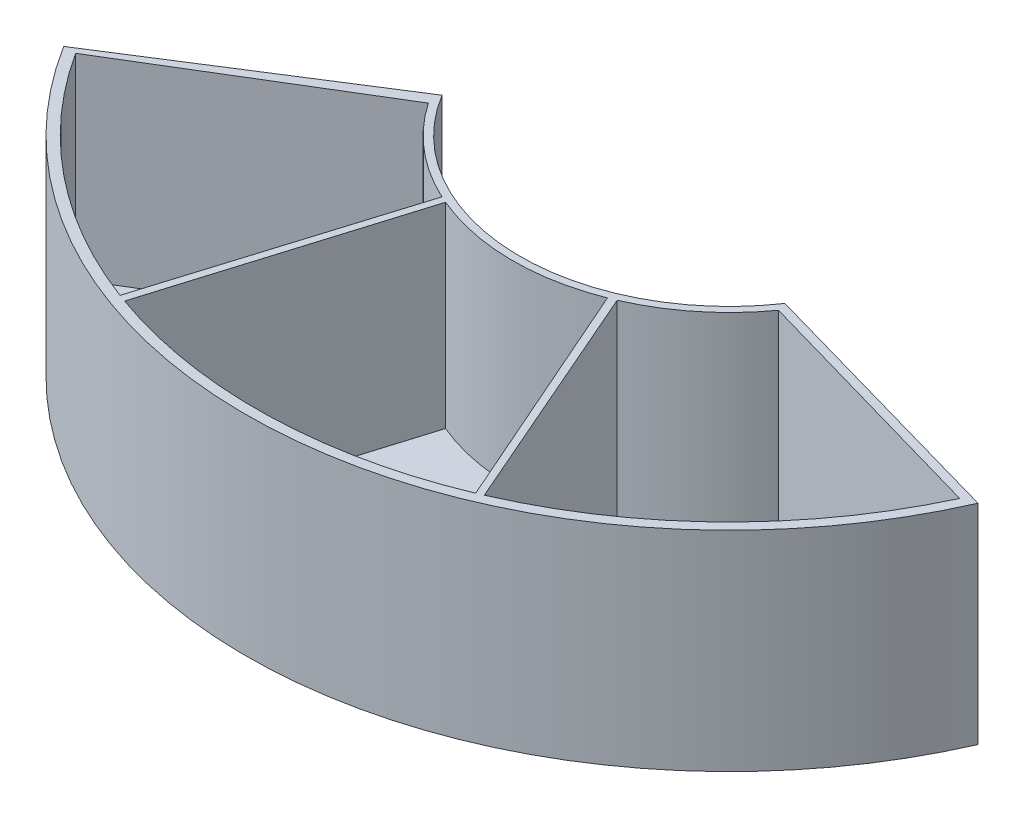
ISO-10303-21;
HEADER;
FILE_DESCRIPTION(('STEP AP214'),'2;1');
FILE_NAME('part.step','',(''),(''),'','','');
FILE_SCHEMA(('AUTOMOTIVE_DESIGN { 1 0 10303 214 1 1 1 1 }'));
ENDSEC;
DATA;
#1=APPLICATION_CONTEXT('core data for automotive mechanical design processes');
#2=APPLICATION_PROTOCOL_DEFINITION('international standard','automotive_design',2000,#1);
#3=PRODUCT_CONTEXT('',#1,'mechanical');
#4=PRODUCT('Part','Part','',(#3));
#5=PRODUCT_RELATED_PRODUCT_CATEGORY('part','',(#4));
#6=PRODUCT_DEFINITION_FORMATION('','',#4);
#7=PRODUCT_DEFINITION_CONTEXT('part definition',#1,'design');
#8=PRODUCT_DEFINITION('design','',#6,#7);
#9=PRODUCT_DEFINITION_SHAPE('','',#8);
#10=(LENGTH_UNIT() NAMED_UNIT(*) SI_UNIT(.MILLI.,.METRE.));
#11=(NAMED_UNIT(*) PLANE_ANGLE_UNIT() SI_UNIT($,.RADIAN.));
#12=(NAMED_UNIT(*) SI_UNIT($,.STERADIAN.) SOLID_ANGLE_UNIT());
#13=UNCERTAINTY_MEASURE_WITH_UNIT(LENGTH_MEASURE(1.E-05),#10,'distance_accuracy_value','');
#14=(GEOMETRIC_REPRESENTATION_CONTEXT(3) GLOBAL_UNCERTAINTY_ASSIGNED_CONTEXT((#13)) GLOBAL_UNIT_ASSIGNED_CONTEXT((#10,
#11,#12)) REPRESENTATION_CONTEXT('',''));
#15=CARTESIAN_POINT('',(0.,0.,0.));
#16=DIRECTION('',(0.,0.,1.));
#17=DIRECTION('',(1.,0.,0.));
#18=AXIS2_PLACEMENT_3D('',#15,#16,#17);
#19=CARTESIAN_POINT('',(0.,80.,0.));
#20=DIRECTION('',(0.,1.,0.));
#21=DIRECTION('',(0.,0.,1.));
#22=AXIS2_PLACEMENT_3D('',#19,#20,#21);
#23=PLANE('',#22);
#24=CARTESIAN_POINT('',(0.,80.,0.));
#25=DIRECTION('',(0.,-1.,0.));
#26=DIRECTION('',(0.,0.,1.));
#27=AXIS2_PLACEMENT_3D('',#24,#25,#26);
#28=CIRCLE('',#27,80.0217204236368);
#29=CARTESIAN_POINT('',(66.2129913480088,80.,44.9367946821667));
#30=VERTEX_POINT('',#29);
#31=CARTESIAN_POINT('',(-68.4050298517927,80.,41.5238200378295));
#32=VERTEX_POINT('',#31);
#33=EDGE_CURVE('E251',#30,#32,#28,.T.);
#34=ORIENTED_EDGE('',*,*,#33,.T.);
#35=DIRECTION('',(-0.844227086214368,0.,0.53598565923166));
#36=VECTOR('',#35,1.);
#37=CARTESIAN_POINT('',(-68.4050298517927,80.,41.5238200378295));
#38=LINE('',#37,#36);
#39=CARTESIAN_POINT('',(-156.962867051797,80.,97.7477099447707));
#40=VERTEX_POINT('',#39);
#41=EDGE_CURVE('E258',#32,#40,#38,.T.);
#42=ORIENTED_EDGE('',*,*,#41,.T.);
#43=CARTESIAN_POINT('',(0.,80.,0.));
#44=DIRECTION('',(0.,1.,0.));
#45=DIRECTION('',(0.,0.,1.));
#46=AXIS2_PLACEMENT_3D('',#43,#44,#45);
#47=CIRCLE('',#46,184.910671494555);
#48=CARTESIAN_POINT('',(169.373640637876,80.,74.1924948336331));
#49=VERTEX_POINT('',#48);
#50=EDGE_CURVE('E260',#40,#49,#47,.T.);
#51=ORIENTED_EDGE('',*,*,#50,.T.);
#52=DIRECTION('',(-0.962061025328391,0.,-0.272834351840243));
#53=VECTOR('',#52,1.);
#54=CARTESIAN_POINT('',(66.2129913480088,80.,44.9367946821667));
#55=LINE('',#54,#53);
#56=EDGE_CURVE('E263',#49,#30,#55,.T.);
#57=ORIENTED_EDGE('',*,*,#56,.T.);
#58=EDGE_LOOP('',(#34,#42,#51,#57));
#59=FACE_BOUND('',#58,.T.);
#60=DIRECTION('',(-0.291273412955168,0.,0.956639848064802));
#61=VECTOR('',#60,1.);
#62=CARTESIAN_POINT('',(-32.2612286960459,80.,76.3245873766926));
#63=LINE('',#62,#61);
#64=CARTESIAN_POINT('',(-32.2612286960459,80.,76.3245873766926));
#65=VERTEX_POINT('',#64);
#66=CARTESIAN_POINT('',(-60.9332233634748,80.,170.493060716158));
#67=VERTEX_POINT('',#66);
#68=EDGE_CURVE('E240',#65,#67,#63,.T.);
#69=ORIENTED_EDGE('',*,*,#68,.F.);
#70=CARTESIAN_POINT('',(0.,80.,0.));
#71=DIRECTION('',(0.,-1.,0.));
#72=DIRECTION('',(0.,0.,1.));
#73=AXIS2_PLACEMENT_3D('',#70,#71,#72);
#74=CIRCLE('',#73,82.8627148674297);
#75=CARTESIAN_POINT('',(30.4436458265412,80.,77.0675933449922));
#76=VERTEX_POINT('',#75);
#77=EDGE_CURVE('E234',#76,#65,#74,.T.);
#78=ORIENTED_EDGE('',*,*,#77,.F.);
#79=DIRECTION('',(-0.40217295362082,0.,-0.915563714536517));
#80=VECTOR('',#79,1.);
#81=CARTESIAN_POINT('',(30.4436458265412,80.,77.0675933449922));
#82=LINE('',#81,#80);
#83=CARTESIAN_POINT('',(69.9465672048778,80.,166.997662253339));
#84=VERTEX_POINT('',#83);
#85=EDGE_CURVE('E245',#84,#76,#82,.T.);
#86=ORIENTED_EDGE('',*,*,#85,.F.);
#87=CARTESIAN_POINT('',(0.,80.,0.));
#88=DIRECTION('',(0.,1.,0.));
#89=DIRECTION('',(0.,0.,1.));
#90=AXIS2_PLACEMENT_3D('',#87,#88,#89);
#91=CIRCLE('',#90,181.054526211931);
#92=EDGE_CURVE('E236',#67,#84,#91,.T.);
#93=ORIENTED_EDGE('',*,*,#92,.F.);
#94=EDGE_LOOP('',(#69,#78,#86,#93));
#95=FACE_BOUND('',#94,.T.);
#96=DIRECTION('',(-0.854855860349568,0.,0.518865549083768));
#97=VECTOR('',#96,1.);
#98=CARTESIAN_POINT('',(-152.401202955816,80.,97.7477099447707));
#99=LINE('',#98,#97);
#100=CARTESIAN_POINT('',(-68.4050298517927,80.,46.7651730048795));
#101=VERTEX_POINT('',#100);
#102=CARTESIAN_POINT('',(-152.401202955816,80.,97.7477099447706));
#103=VERTEX_POINT('',#102);
#104=EDGE_CURVE('E220',#101,#103,#99,.T.);
#105=ORIENTED_EDGE('',*,*,#104,.F.);
#106=CARTESIAN_POINT('',(0.,80.,0.));
#107=DIRECTION('',(0.,-1.,0.));
#108=DIRECTION('',(0.,0.,1.));
#109=AXIS2_PLACEMENT_3D('',#106,#107,#108);
#110=CIRCLE('',#109,82.8627148674298);
#111=CARTESIAN_POINT('',(-34.7254713536812,80.,75.2354381556034));
#112=VERTEX_POINT('',#111);
#113=EDGE_CURVE('E214',#112,#101,#110,.T.);
#114=ORIENTED_EDGE('',*,*,#113,.F.);
#115=DIRECTION('',(0.293742661285679,0.,-0.955884537452514));
#116=VECTOR('',#115,1.);
#117=CARTESIAN_POINT('',(-34.7254713536812,80.,75.2354381556034));
#118=LINE('',#117,#116);
#119=CARTESIAN_POINT('',(-63.6877906538465,80.,169.483352526018));
#120=VERTEX_POINT('',#119);
#121=EDGE_CURVE('E225',#120,#112,#118,.T.);
#122=ORIENTED_EDGE('',*,*,#121,.F.);
#123=CARTESIAN_POINT('',(0.,80.,0.));
#124=DIRECTION('',(0.,1.,0.));
#125=DIRECTION('',(0.,0.,1.));
#126=AXIS2_PLACEMENT_3D('',#123,#124,#125);
#127=CIRCLE('',#126,181.054526211931);
#128=EDGE_CURVE('E219',#103,#120,#127,.T.);
#129=ORIENTED_EDGE('',*,*,#128,.F.);
#130=EDGE_LOOP('',(#105,#114,#122,#129));
#131=FACE_BOUND('',#130,.T.);
#132=DIRECTION('',(-0.961583026948567,0.,-0.274514266085446));
#133=VECTOR('',#132,1.);
#134=CARTESIAN_POINT('',(67.2480144372819,80.,48.4141928513126));
#135=LINE('',#134,#133);
#136=CARTESIAN_POINT('',(164.278182262394,80.,76.1145209167776));
#137=VERTEX_POINT('',#136);
#138=CARTESIAN_POINT('',(67.2480144372819,80.,48.4141928513126));
#139=VERTEX_POINT('',#138);
#140=EDGE_CURVE('E203',#137,#139,#135,.T.);
#141=ORIENTED_EDGE('',*,*,#140,.F.);
#142=CARTESIAN_POINT('',(0.,80.,0.));
#143=DIRECTION('',(0.,1.,0.));
#144=DIRECTION('',(0.,0.,1.));
#145=AXIS2_PLACEMENT_3D('',#142,#143,#144);
#146=CIRCLE('',#145,181.054526211931);
#147=CARTESIAN_POINT('',(72.2517662339433,80.,166.01332397703));
#148=VERTEX_POINT('',#147);
#149=EDGE_CURVE('E201',#148,#137,#146,.T.);
#150=ORIENTED_EDGE('',*,*,#149,.F.);
#151=DIRECTION('',(0.399060811931153,0.,0.916924461654748));
#152=VECTOR('',#151,1.);
#153=CARTESIAN_POINT('',(33.0672622738161,80.,75.9788502210689));
#154=LINE('',#153,#152);
#155=CARTESIAN_POINT('',(33.0672622738161,80.,75.9788502210689));
#156=VERTEX_POINT('',#155);
#157=EDGE_CURVE('E159',#156,#148,#154,.T.);
#158=ORIENTED_EDGE('',*,*,#157,.F.);
#159=CARTESIAN_POINT('',(0.,80.,0.));
#160=DIRECTION('',(0.,-1.,0.));
#161=DIRECTION('',(0.,0.,1.));
#162=AXIS2_PLACEMENT_3D('',#159,#160,#161);
#163=CIRCLE('',#162,82.8627148674298);
#164=EDGE_CURVE('E210',#139,#156,#163,.T.);
#165=ORIENTED_EDGE('',*,*,#164,.F.);
#166=EDGE_LOOP('',(#141,#150,#158,#165));
#167=FACE_BOUND('',#166,.T.);
#168=ADVANCED_FACE('F39',(#59,#95,#131,#167),#23,.T.);
#169=CARTESIAN_POINT('',(0.,0.,0.));
#170=DIRECTION('',(0.,1.,0.));
#171=DIRECTION('',(0.,0.,1.));
#172=AXIS2_PLACEMENT_3D('',#169,#170,#171);
#173=PLANE('',#172);
#174=CARTESIAN_POINT('',(0.,0.,0.));
#175=DIRECTION('',(0.,-1.,0.));
#176=DIRECTION('',(0.,0.,1.));
#177=AXIS2_PLACEMENT_3D('',#174,#175,#176);
#178=CIRCLE('',#177,80.0217204236368);
#179=CARTESIAN_POINT('',(66.2129913480088,0.,44.9367946821667));
#180=VERTEX_POINT('',#179);
#181=CARTESIAN_POINT('',(-68.4050298517927,0.,41.5238200378295));
#182=VERTEX_POINT('',#181);
#183=EDGE_CURVE('E255',#180,#182,#178,.T.);
#184=ORIENTED_EDGE('',*,*,#183,.F.);
#185=DIRECTION('',(-0.962061025328391,0.,-0.272834351840243));
#186=VECTOR('',#185,1.);
#187=CARTESIAN_POINT('',(66.2129913480088,0.,44.9367946821667));
#188=LINE('',#187,#186);
#189=CARTESIAN_POINT('',(169.373640637876,0.,74.1924948336331));
#190=VERTEX_POINT('',#189);
#191=EDGE_CURVE('E257',#190,#180,#188,.T.);
#192=ORIENTED_EDGE('',*,*,#191,.F.);
#193=CARTESIAN_POINT('',(0.,0.,0.));
#194=DIRECTION('',(0.,1.,0.));
#195=DIRECTION('',(0.,0.,1.));
#196=AXIS2_PLACEMENT_3D('',#193,#194,#195);
#197=CIRCLE('',#196,184.910671494555);
#198=CARTESIAN_POINT('',(-156.962867051797,0.,97.7477099447707));
#199=VERTEX_POINT('',#198);
#200=EDGE_CURVE('E267',#199,#190,#197,.T.);
#201=ORIENTED_EDGE('',*,*,#200,.F.);
#202=DIRECTION('',(-0.844227086214368,0.,0.53598565923166));
#203=VECTOR('',#202,1.);
#204=CARTESIAN_POINT('',(-68.4050298517927,0.,41.5238200378295));
#205=LINE('',#204,#203);
#206=EDGE_CURVE('E266',#182,#199,#205,.T.);
#207=ORIENTED_EDGE('',*,*,#206,.F.);
#208=EDGE_LOOP('',(#184,#192,#201,#207));
#209=FACE_BOUND('',#208,.T.);
#210=ADVANCED_FACE('F286',(#209),#173,.F.);
#211=CARTESIAN_POINT('',(0.,80.,0.));
#212=DIRECTION('',(0.,-1.,0.));
#213=DIRECTION('',(0.,0.,-1.));
#214=AXIS2_PLACEMENT_3D('',#211,#212,#213);
#215=CYLINDRICAL_SURFACE('',#214,80.0217204236368);
#216=ORIENTED_EDGE('',*,*,#183,.T.);
#217=DIRECTION('',(0.,-1.,0.));
#218=VECTOR('',#217,1.);
#219=CARTESIAN_POINT('',(-68.4050298517927,80.,41.5238200378295));
#220=LINE('',#219,#218);
#221=EDGE_CURVE('E50',#32,#182,#220,.T.);
#222=ORIENTED_EDGE('',*,*,#221,.F.);
#223=ORIENTED_EDGE('',*,*,#33,.F.);
#224=DIRECTION('',(0.,-1.,0.));
#225=VECTOR('',#224,1.);
#226=CARTESIAN_POINT('',(66.2129913480088,80.,44.9367946821667));
#227=LINE('',#226,#225);
#228=EDGE_CURVE('E261',#30,#180,#227,.T.);
#229=ORIENTED_EDGE('',*,*,#228,.T.);
#230=EDGE_LOOP('',(#216,#222,#223,#229));
#231=FACE_BOUND('',#230,.T.);
#232=ADVANCED_FACE('F41',(#231),#215,.F.);
#233=CARTESIAN_POINT('',(-68.4050298517927,80.,41.5238200378295));
#234=DIRECTION('',(0.53598565923166,0.,0.844227086214368));
#235=DIRECTION('',(0.844227086214368,0.,-0.53598565923166));
#236=AXIS2_PLACEMENT_3D('',#233,#234,#235);
#237=PLANE('',#236);
#238=ORIENTED_EDGE('',*,*,#206,.T.);
#239=DIRECTION('',(0.,-1.,0.));
#240=VECTOR('',#239,1.);
#241=CARTESIAN_POINT('',(-156.962867051797,80.,97.7477099447707));
#242=LINE('',#241,#240);
#243=EDGE_CURVE('E280',#40,#199,#242,.T.);
#244=ORIENTED_EDGE('',*,*,#243,.F.);
#245=ORIENTED_EDGE('',*,*,#41,.F.);
#246=ORIENTED_EDGE('',*,*,#221,.T.);
#247=EDGE_LOOP('',(#238,#244,#245,#246));
#248=FACE_BOUND('',#247,.T.);
#249=ADVANCED_FACE('F282',(#248),#237,.F.);
#250=CARTESIAN_POINT('',(0.,80.,0.));
#251=DIRECTION('',(0.,-1.,0.));
#252=DIRECTION('',(0.,0.,-1.));
#253=AXIS2_PLACEMENT_3D('',#250,#251,#252);
#254=CYLINDRICAL_SURFACE('',#253,184.910671494555);
#255=ORIENTED_EDGE('',*,*,#200,.T.);
#256=DIRECTION('',(0.,-1.,0.));
#257=VECTOR('',#256,1.);
#258=CARTESIAN_POINT('',(169.373640637876,80.,74.1924948336331));
#259=LINE('',#258,#257);
#260=EDGE_CURVE('E274',#49,#190,#259,.T.);
#261=ORIENTED_EDGE('',*,*,#260,.F.);
#262=ORIENTED_EDGE('',*,*,#50,.F.);
#263=ORIENTED_EDGE('',*,*,#243,.T.);
#264=EDGE_LOOP('',(#255,#261,#262,#263));
#265=FACE_BOUND('',#264,.T.);
#266=ADVANCED_FACE('F300',(#265),#254,.T.);
#267=CARTESIAN_POINT('',(66.2129913480088,80.,44.9367946821667));
#268=DIRECTION('',(-0.272834351840243,0.,0.962061025328391));
#269=DIRECTION('',(0.962061025328391,0.,0.272834351840243));
#270=AXIS2_PLACEMENT_3D('',#267,#268,#269);
#271=PLANE('',#270);
#272=ORIENTED_EDGE('',*,*,#191,.T.);
#273=ORIENTED_EDGE('',*,*,#228,.F.);
#274=ORIENTED_EDGE('',*,*,#56,.F.);
#275=ORIENTED_EDGE('',*,*,#260,.T.);
#276=EDGE_LOOP('',(#272,#273,#274,#275));
#277=FACE_BOUND('',#276,.T.);
#278=ADVANCED_FACE('F291',(#277),#271,.F.);
#279=CARTESIAN_POINT('',(0.,80.,0.));
#280=DIRECTION('',(0.,-1.,0.));
#281=DIRECTION('',(0.,0.,-1.));
#282=AXIS2_PLACEMENT_3D('',#279,#280,#281);
#283=CYLINDRICAL_SURFACE('',#282,82.8627148674297);
#284=CARTESIAN_POINT('',(0.,5.,0.));
#285=DIRECTION('',(0.,1.,0.));
#286=DIRECTION('',(0.,0.,1.));
#287=AXIS2_PLACEMENT_3D('',#284,#285,#286);
#288=CIRCLE('',#287,82.8627148674297);
#289=CARTESIAN_POINT('',(30.4436458265412,5.,77.0675933449922));
#290=VERTEX_POINT('',#289);
#291=CARTESIAN_POINT('',(-32.2612286960459,5.,76.3245873766926));
#292=VERTEX_POINT('',#291);
#293=EDGE_CURVE('E199',#290,#292,#288,.F.);
#294=ORIENTED_EDGE('',*,*,#293,.F.);
#295=DIRECTION('',(0.,-1.,0.));
#296=VECTOR('',#295,1.);
#297=CARTESIAN_POINT('',(30.4436458265412,80.,77.0675933449922));
#298=LINE('',#297,#296);
#299=EDGE_CURVE('E242',#76,#290,#298,.T.);
#300=ORIENTED_EDGE('',*,*,#299,.F.);
#301=ORIENTED_EDGE('',*,*,#77,.T.);
#302=DIRECTION('',(0.,-1.,0.));
#303=VECTOR('',#302,1.);
#304=CARTESIAN_POINT('',(-32.2612286960459,80.,76.3245873766926));
#305=LINE('',#304,#303);
#306=EDGE_CURVE('E248',#65,#292,#305,.T.);
#307=ORIENTED_EDGE('',*,*,#306,.T.);
#308=EDGE_LOOP('',(#294,#300,#301,#307));
#309=FACE_BOUND('',#308,.T.);
#310=ADVANCED_FACE('F351',(#309),#283,.T.);
#311=CARTESIAN_POINT('',(-32.2612286960459,80.,76.3245873766926));
#312=DIRECTION('',(0.956639848064802,0.,0.291273412955168));
#313=DIRECTION('',(0.291273412955168,0.,-0.956639848064803));
#314=AXIS2_PLACEMENT_3D('',#311,#312,#313);
#315=PLANE('',#314);
#316=DIRECTION('',(-0.291273412955168,0.,0.956639848064803));
#317=VECTOR('',#316,1.);
#318=CARTESIAN_POINT('',(-32.2612286960459,5.,76.3245873766926));
#319=LINE('',#318,#317);
#320=CARTESIAN_POINT('',(-60.9332233634748,5.,170.493060716158));
#321=VERTEX_POINT('',#320);
#322=EDGE_CURVE('E53',#292,#321,#319,.T.);
#323=ORIENTED_EDGE('',*,*,#322,.F.);
#324=ORIENTED_EDGE('',*,*,#306,.F.);
#325=ORIENTED_EDGE('',*,*,#68,.T.);
#326=DIRECTION('',(0.,-1.,0.));
#327=VECTOR('',#326,1.);
#328=CARTESIAN_POINT('',(-60.9332233634748,80.,170.493060716158));
#329=LINE('',#328,#327);
#330=EDGE_CURVE('E246',#67,#321,#329,.T.);
#331=ORIENTED_EDGE('',*,*,#330,.T.);
#332=EDGE_LOOP('',(#323,#324,#325,#331));
#333=FACE_BOUND('',#332,.T.);
#334=ADVANCED_FACE('F349',(#333),#315,.T.);
#335=CARTESIAN_POINT('',(0.,80.,0.));
#336=DIRECTION('',(0.,-1.,0.));
#337=DIRECTION('',(0.,0.,-1.));
#338=AXIS2_PLACEMENT_3D('',#335,#336,#337);
#339=CYLINDRICAL_SURFACE('',#338,181.054526211931);
#340=CARTESIAN_POINT('',(0.,5.,0.));
#341=DIRECTION('',(0.,1.,0.));
#342=DIRECTION('',(0.,0.,1.));
#343=AXIS2_PLACEMENT_3D('',#340,#341,#342);
#344=CIRCLE('',#343,181.054526211931);
#345=CARTESIAN_POINT('',(69.9465672048777,5.,166.997662253339));
#346=VERTEX_POINT('',#345);
#347=EDGE_CURVE('E65',#321,#346,#344,.T.);
#348=ORIENTED_EDGE('',*,*,#347,.F.);
#349=ORIENTED_EDGE('',*,*,#330,.F.);
#350=ORIENTED_EDGE('',*,*,#92,.T.);
#351=DIRECTION('',(0.,-1.,0.));
#352=VECTOR('',#351,1.);
#353=CARTESIAN_POINT('',(69.9465672048777,80.,166.997662253339));
#354=LINE('',#353,#352);
#355=EDGE_CURVE('E247',#84,#346,#354,.T.);
#356=ORIENTED_EDGE('',*,*,#355,.T.);
#357=EDGE_LOOP('',(#348,#349,#350,#356));
#358=FACE_BOUND('',#357,.T.);
#359=ADVANCED_FACE('F348',(#358),#339,.F.);
#360=CARTESIAN_POINT('',(30.4436458265412,80.,77.0675933449922));
#361=DIRECTION('',(-0.915563714536517,0.,0.40217295362082));
#362=DIRECTION('',(0.40217295362082,0.,0.915563714536517));
#363=AXIS2_PLACEMENT_3D('',#360,#361,#362);
#364=PLANE('',#363);
#365=DIRECTION('',(-0.40217295362082,0.,-0.915563714536517));
#366=VECTOR('',#365,1.);
#367=CARTESIAN_POINT('',(30.4436458265412,5.,77.0675933449922));
#368=LINE('',#367,#366);
#369=EDGE_CURVE('E193',#346,#290,#368,.T.);
#370=ORIENTED_EDGE('',*,*,#369,.F.);
#371=ORIENTED_EDGE('',*,*,#355,.F.);
#372=ORIENTED_EDGE('',*,*,#85,.T.);
#373=ORIENTED_EDGE('',*,*,#299,.T.);
#374=EDGE_LOOP('',(#370,#371,#372,#373));
#375=FACE_BOUND('',#374,.T.);
#376=ADVANCED_FACE('F345',(#375),#364,.T.);
#377=CARTESIAN_POINT('',(0.,80.,0.));
#378=DIRECTION('',(0.,-1.,0.));
#379=DIRECTION('',(0.,0.,-1.));
#380=AXIS2_PLACEMENT_3D('',#377,#378,#379);
#381=CYLINDRICAL_SURFACE('',#380,82.8627148674298);
#382=CARTESIAN_POINT('',(0.,5.,0.));
#383=DIRECTION('',(0.,1.,0.));
#384=DIRECTION('',(0.,0.,1.));
#385=AXIS2_PLACEMENT_3D('',#382,#383,#384);
#386=CIRCLE('',#385,82.8627148674298);
#387=CARTESIAN_POINT('',(-34.7254713536812,5.,75.2354381556034));
#388=VERTEX_POINT('',#387);
#389=CARTESIAN_POINT('',(-68.4050298517927,5.,46.7651730048795));
#390=VERTEX_POINT('',#389);
#391=EDGE_CURVE('E195',#388,#390,#386,.F.);
#392=ORIENTED_EDGE('',*,*,#391,.F.);
#393=DIRECTION('',(0.,-1.,0.));
#394=VECTOR('',#393,1.);
#395=CARTESIAN_POINT('',(-34.7254713536812,80.,75.2354381556034));
#396=LINE('',#395,#394);
#397=EDGE_CURVE('E222',#112,#388,#396,.T.);
#398=ORIENTED_EDGE('',*,*,#397,.F.);
#399=ORIENTED_EDGE('',*,*,#113,.T.);
#400=DIRECTION('',(0.,-1.,0.));
#401=VECTOR('',#400,1.);
#402=CARTESIAN_POINT('',(-68.4050298517927,80.,46.7651730048795));
#403=LINE('',#402,#401);
#404=EDGE_CURVE('E235',#101,#390,#403,.T.);
#405=ORIENTED_EDGE('',*,*,#404,.T.);
#406=EDGE_LOOP('',(#392,#398,#399,#405));
#407=FACE_BOUND('',#406,.T.);
#408=ADVANCED_FACE('F336',(#407),#381,.T.);
#409=CARTESIAN_POINT('',(-152.401202955816,80.,97.7477099447707));
#410=DIRECTION('',(0.518865549083768,0.,0.854855860349568));
#411=DIRECTION('',(0.854855860349568,0.,-0.518865549083768));
#412=AXIS2_PLACEMENT_3D('',#409,#410,#411);
#413=PLANE('',#412);
#414=DIRECTION('',(-0.854855860349568,0.,0.518865549083768));
#415=VECTOR('',#414,1.);
#416=CARTESIAN_POINT('',(-152.401202955816,5.,97.7477099447707));
#417=LINE('',#416,#415);
#418=CARTESIAN_POINT('',(-152.401202955816,5.,97.7477099447706));
#419=VERTEX_POINT('',#418);
#420=EDGE_CURVE('E188',#390,#419,#417,.T.);
#421=ORIENTED_EDGE('',*,*,#420,.F.);
#422=ORIENTED_EDGE('',*,*,#404,.F.);
#423=ORIENTED_EDGE('',*,*,#104,.T.);
#424=DIRECTION('',(0.,-1.,0.));
#425=VECTOR('',#424,1.);
#426=CARTESIAN_POINT('',(-152.401202955816,80.,97.7477099447706));
#427=LINE('',#426,#425);
#428=EDGE_CURVE('E227',#103,#419,#427,.T.);
#429=ORIENTED_EDGE('',*,*,#428,.T.);
#430=EDGE_LOOP('',(#421,#422,#423,#429));
#431=FACE_BOUND('',#430,.T.);
#432=ADVANCED_FACE('F332',(#431),#413,.T.);
#433=CARTESIAN_POINT('',(0.,80.,0.));
#434=DIRECTION('',(0.,-1.,0.));
#435=DIRECTION('',(0.,0.,-1.));
#436=AXIS2_PLACEMENT_3D('',#433,#434,#435);
#437=CYLINDRICAL_SURFACE('',#436,181.054526211931);
#438=CARTESIAN_POINT('',(0.,5.,0.));
#439=DIRECTION('',(0.,1.,0.));
#440=DIRECTION('',(0.,0.,1.));
#441=AXIS2_PLACEMENT_3D('',#438,#439,#440);
#442=CIRCLE('',#441,181.054526211931);
#443=CARTESIAN_POINT('',(-63.6877906538465,5.,169.483352526018));
#444=VERTEX_POINT('',#443);
#445=EDGE_CURVE('E186',#419,#444,#442,.T.);
#446=ORIENTED_EDGE('',*,*,#445,.F.);
#447=ORIENTED_EDGE('',*,*,#428,.F.);
#448=ORIENTED_EDGE('',*,*,#128,.T.);
#449=DIRECTION('',(0.,-1.,0.));
#450=VECTOR('',#449,1.);
#451=CARTESIAN_POINT('',(-63.6877906538465,80.,169.483352526018));
#452=LINE('',#451,#450);
#453=EDGE_CURVE('E226',#120,#444,#452,.T.);
#454=ORIENTED_EDGE('',*,*,#453,.T.);
#455=EDGE_LOOP('',(#446,#447,#448,#454));
#456=FACE_BOUND('',#455,.T.);
#457=ADVANCED_FACE('F328',(#456),#437,.F.);
#458=CARTESIAN_POINT('',(-34.7254713536812,80.,75.2354381556034));
#459=DIRECTION('',(-0.955884537452514,0.,-0.293742661285679));
#460=DIRECTION('',(-0.293742661285679,0.,0.955884537452514));
#461=AXIS2_PLACEMENT_3D('',#458,#459,#460);
#462=PLANE('',#461);
#463=DIRECTION('',(0.293742661285679,0.,-0.955884537452514));
#464=VECTOR('',#463,1.);
#465=CARTESIAN_POINT('',(-34.7254713536812,5.,75.2354381556034));
#466=LINE('',#465,#464);
#467=EDGE_CURVE('E175',#444,#388,#466,.T.);
#468=ORIENTED_EDGE('',*,*,#467,.F.);
#469=ORIENTED_EDGE('',*,*,#453,.F.);
#470=ORIENTED_EDGE('',*,*,#121,.T.);
#471=ORIENTED_EDGE('',*,*,#397,.T.);
#472=EDGE_LOOP('',(#468,#469,#470,#471));
#473=FACE_BOUND('',#472,.T.);
#474=ADVANCED_FACE('F330',(#473),#462,.T.);
#475=CARTESIAN_POINT('',(0.,80.,0.));
#476=DIRECTION('',(0.,-1.,0.));
#477=DIRECTION('',(0.,0.,-1.));
#478=AXIS2_PLACEMENT_3D('',#475,#476,#477);
#479=CYLINDRICAL_SURFACE('',#478,181.054526211931);
#480=CARTESIAN_POINT('',(0.,5.,0.));
#481=DIRECTION('',(0.,1.,0.));
#482=DIRECTION('',(0.,0.,1.));
#483=AXIS2_PLACEMENT_3D('',#480,#481,#482);
#484=CIRCLE('',#483,181.054526211931);
#485=CARTESIAN_POINT('',(72.2517662339434,5.,166.01332397703));
#486=VERTEX_POINT('',#485);
#487=CARTESIAN_POINT('',(164.278182262394,5.,76.1145209167776));
#488=VERTEX_POINT('',#487);
#489=EDGE_CURVE('E168',#486,#488,#484,.T.);
#490=ORIENTED_EDGE('',*,*,#489,.F.);
#491=DIRECTION('',(0.,-1.,0.));
#492=VECTOR('',#491,1.);
#493=CARTESIAN_POINT('',(72.2517662339433,80.,166.01332397703));
#494=LINE('',#493,#492);
#495=EDGE_CURVE('E152',#148,#486,#494,.T.);
#496=ORIENTED_EDGE('',*,*,#495,.F.);
#497=ORIENTED_EDGE('',*,*,#149,.T.);
#498=DIRECTION('',(0.,-1.,0.));
#499=VECTOR('',#498,1.);
#500=CARTESIAN_POINT('',(164.278182262394,80.,76.1145209167776));
#501=LINE('',#500,#499);
#502=EDGE_CURVE('E170',#137,#488,#501,.T.);
#503=ORIENTED_EDGE('',*,*,#502,.T.);
#504=EDGE_LOOP('',(#490,#496,#497,#503));
#505=FACE_BOUND('',#504,.T.);
#506=ADVANCED_FACE('F167',(#505),#479,.F.);
#507=CARTESIAN_POINT('',(67.2480144372819,80.,48.4141928513126));
#508=DIRECTION('',(-0.274514266085446,0.,0.961583026948567));
#509=DIRECTION('',(0.961583026948567,0.,0.274514266085446));
#510=AXIS2_PLACEMENT_3D('',#507,#508,#509);
#511=PLANE('',#510);
#512=DIRECTION('',(-0.961583026948567,0.,-0.274514266085446));
#513=VECTOR('',#512,1.);
#514=CARTESIAN_POINT('',(67.2480144372819,5.,48.4141928513126));
#515=LINE('',#514,#513);
#516=CARTESIAN_POINT('',(67.2480144372819,5.,48.4141928513126));
#517=VERTEX_POINT('',#516);
#518=EDGE_CURVE('E171',#488,#517,#515,.T.);
#519=ORIENTED_EDGE('',*,*,#518,.F.);
#520=ORIENTED_EDGE('',*,*,#502,.F.);
#521=ORIENTED_EDGE('',*,*,#140,.T.);
#522=DIRECTION('',(0.,-1.,0.));
#523=VECTOR('',#522,1.);
#524=CARTESIAN_POINT('',(67.2480144372819,80.,48.4141928513126));
#525=LINE('',#524,#523);
#526=EDGE_CURVE('E212',#139,#517,#525,.T.);
#527=ORIENTED_EDGE('',*,*,#526,.T.);
#528=EDGE_LOOP('',(#519,#520,#521,#527));
#529=FACE_BOUND('',#528,.T.);
#530=ADVANCED_FACE('F313',(#529),#511,.T.);
#531=CARTESIAN_POINT('',(0.,80.,0.));
#532=DIRECTION('',(0.,-1.,0.));
#533=DIRECTION('',(0.,0.,-1.));
#534=AXIS2_PLACEMENT_3D('',#531,#532,#533);
#535=CYLINDRICAL_SURFACE('',#534,82.8627148674298);
#536=CARTESIAN_POINT('',(0.,5.,0.));
#537=DIRECTION('',(0.,1.,0.));
#538=DIRECTION('',(0.,0.,1.));
#539=AXIS2_PLACEMENT_3D('',#536,#537,#538);
#540=CIRCLE('',#539,82.8627148674298);
#541=CARTESIAN_POINT('',(33.0672622738161,5.,75.9788502210689));
#542=VERTEX_POINT('',#541);
#543=EDGE_CURVE('E180',#517,#542,#540,.F.);
#544=ORIENTED_EDGE('',*,*,#543,.F.);
#545=ORIENTED_EDGE('',*,*,#526,.F.);
#546=ORIENTED_EDGE('',*,*,#164,.T.);
#547=DIRECTION('',(0.,-1.,0.));
#548=VECTOR('',#547,1.);
#549=CARTESIAN_POINT('',(33.0672622738161,80.,75.9788502210689));
#550=LINE('',#549,#548);
#551=EDGE_CURVE('E165',#156,#542,#550,.T.);
#552=ORIENTED_EDGE('',*,*,#551,.T.);
#553=EDGE_LOOP('',(#544,#545,#546,#552));
#554=FACE_BOUND('',#553,.T.);
#555=ADVANCED_FACE('F312',(#554),#535,.T.);
#556=CARTESIAN_POINT('',(33.0672622738161,80.,75.9788502210689));
#557=DIRECTION('',(0.916924461654748,0.,-0.399060811931153));
#558=DIRECTION('',(-0.399060811931153,0.,-0.916924461654748));
#559=AXIS2_PLACEMENT_3D('',#556,#557,#558);
#560=PLANE('',#559);
#561=DIRECTION('',(0.399060811931153,0.,0.916924461654748));
#562=VECTOR('',#561,1.);
#563=CARTESIAN_POINT('',(33.0672622738161,5.,75.9788502210689));
#564=LINE('',#563,#562);
#565=EDGE_CURVE('E11',#542,#486,#564,.T.);
#566=ORIENTED_EDGE('',*,*,#565,.F.);
#567=ORIENTED_EDGE('',*,*,#551,.F.);
#568=ORIENTED_EDGE('',*,*,#157,.T.);
#569=ORIENTED_EDGE('',*,*,#495,.T.);
#570=EDGE_LOOP('',(#566,#567,#568,#569));
#571=FACE_BOUND('',#570,.T.);
#572=ADVANCED_FACE('F157',(#571),#560,.T.);
#573=CARTESIAN_POINT('',(0.,5.,0.));
#574=DIRECTION('',(0.,1.,0.));
#575=DIRECTION('',(0.,0.,1.));
#576=AXIS2_PLACEMENT_3D('',#573,#574,#575);
#577=PLANE('',#576);
#578=ORIENTED_EDGE('',*,*,#565,.T.);
#579=ORIENTED_EDGE('',*,*,#489,.T.);
#580=ORIENTED_EDGE('',*,*,#518,.T.);
#581=ORIENTED_EDGE('',*,*,#543,.T.);
#582=EDGE_LOOP('',(#578,#579,#580,#581));
#583=FACE_BOUND('',#582,.T.);
#584=ADVANCED_FACE('F176',(#583),#577,.T.);
#585=ORIENTED_EDGE('',*,*,#467,.T.);
#586=ORIENTED_EDGE('',*,*,#391,.T.);
#587=ORIENTED_EDGE('',*,*,#420,.T.);
#588=ORIENTED_EDGE('',*,*,#445,.T.);
#589=EDGE_LOOP('',(#585,#586,#587,#588));
#590=FACE_BOUND('',#589,.T.);
#591=ADVANCED_FACE('F463',(#590),#577,.T.);
#592=ORIENTED_EDGE('',*,*,#369,.T.);
#593=ORIENTED_EDGE('',*,*,#293,.T.);
#594=ORIENTED_EDGE('',*,*,#322,.T.);
#595=ORIENTED_EDGE('',*,*,#347,.T.);
#596=EDGE_LOOP('',(#592,#593,#594,#595));
#597=FACE_BOUND('',#596,.T.);
#598=ADVANCED_FACE('F468',(#597),#577,.T.);
#599=CLOSED_SHELL('',(#168,#210,#232,#249,#266,#278,#310,#334,#359,#376,#408,#432,#457,#474,
#506,#530,#555,#572,#584,#591,#598));
#600=MANIFOLD_SOLID_BREP('B2',#599);
#601=ADVANCED_BREP_SHAPE_REPRESENTATION('',(#18,#600),#14);
#602=SHAPE_DEFINITION_REPRESENTATION(#9,#601);
ENDSEC;
END-ISO-10303-21;
